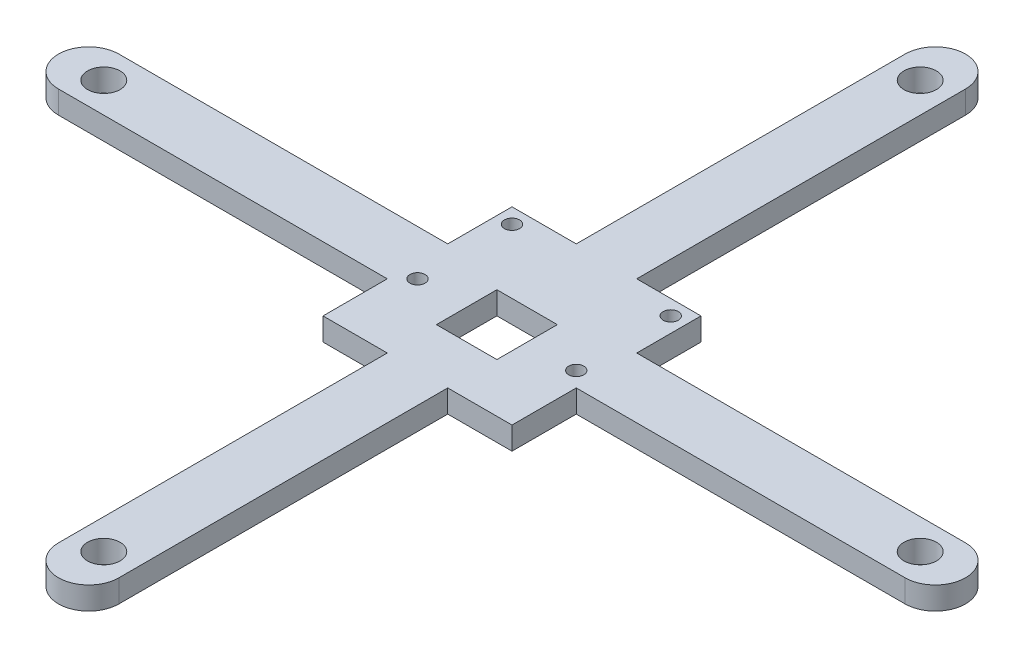
ISO-10303-21;
HEADER;
FILE_DESCRIPTION(('STEP AP214'),'2;1');
FILE_NAME('part.step','',(''),(''),'','','');
FILE_SCHEMA(('AUTOMOTIVE_DESIGN { 1 0 10303 214 1 1 1 1 }'));
ENDSEC;
DATA;
#1=APPLICATION_CONTEXT('core data for automotive mechanical design processes');
#2=APPLICATION_PROTOCOL_DEFINITION('international standard','automotive_design',2000,#1);
#3=PRODUCT_CONTEXT('',#1,'mechanical');
#4=PRODUCT('Part','Part','',(#3));
#5=PRODUCT_RELATED_PRODUCT_CATEGORY('part','',(#4));
#6=PRODUCT_DEFINITION_FORMATION('','',#4);
#7=PRODUCT_DEFINITION_CONTEXT('part definition',#1,'design');
#8=PRODUCT_DEFINITION('design','',#6,#7);
#9=PRODUCT_DEFINITION_SHAPE('','',#8);
#10=(LENGTH_UNIT() NAMED_UNIT(*) SI_UNIT(.MILLI.,.METRE.));
#11=(NAMED_UNIT(*) PLANE_ANGLE_UNIT() SI_UNIT($,.RADIAN.));
#12=(NAMED_UNIT(*) SI_UNIT($,.STERADIAN.) SOLID_ANGLE_UNIT());
#13=UNCERTAINTY_MEASURE_WITH_UNIT(LENGTH_MEASURE(1.E-05),#10,'distance_accuracy_value','');
#14=(GEOMETRIC_REPRESENTATION_CONTEXT(3) GLOBAL_UNCERTAINTY_ASSIGNED_CONTEXT((#13)) GLOBAL_UNIT_ASSIGNED_CONTEXT((#10,
#11,#12)) REPRESENTATION_CONTEXT('',''));
#15=CARTESIAN_POINT('',(0.,0.,0.));
#16=DIRECTION('',(0.,0.,1.));
#17=DIRECTION('',(1.,0.,0.));
#18=AXIS2_PLACEMENT_3D('',#15,#16,#17);
#19=CARTESIAN_POINT('',(55.9999998056097,3.,0.));
#20=DIRECTION('',(0.,1.,0.));
#21=DIRECTION('',(0.,0.,1.));
#22=AXIS2_PLACEMENT_3D('',#19,#20,#21);
#23=PLANE('',#22);
#24=CARTESIAN_POINT('',(54.,3.,0.));
#25=DIRECTION('',(0.,1.,0.));
#26=DIRECTION('',(0.,0.,1.));
#27=AXIS2_PLACEMENT_3D('',#24,#25,#26);
#28=CIRCLE('',#27,2.15);
#29=CARTESIAN_POINT('',(54.,3.,2.14999999999999));
#30=VERTEX_POINT('',#29);
#31=EDGE_CURVE('E959',#30,#30,#28,.T.);
#32=ORIENTED_EDGE('',*,*,#31,.F.);
#33=EDGE_LOOP('',(#32));
#34=FACE_BOUND('',#33,.T.);
#35=CARTESIAN_POINT('',(-54.,3.,0.));
#36=DIRECTION('',(0.,1.,0.));
#37=DIRECTION('',(0.,0.,1.));
#38=AXIS2_PLACEMENT_3D('',#35,#36,#37);
#39=CIRCLE('',#38,2.15);
#40=CARTESIAN_POINT('',(-54.,3.,2.15));
#41=VERTEX_POINT('',#40);
#42=EDGE_CURVE('E240',#41,#41,#39,.T.);
#43=ORIENTED_EDGE('',*,*,#42,.F.);
#44=EDGE_LOOP('',(#43));
#45=FACE_BOUND('',#44,.T.);
#46=CARTESIAN_POINT('',(-10.5,3.,2.));
#47=DIRECTION('',(0.,1.,0.));
#48=DIRECTION('',(0.,0.,1.));
#49=AXIS2_PLACEMENT_3D('',#46,#47,#48);
#50=CIRCLE('',#49,1.);
#51=CARTESIAN_POINT('',(-10.5,3.,3.));
#52=VERTEX_POINT('',#51);
#53=EDGE_CURVE('E264',#52,#52,#50,.T.);
#54=ORIENTED_EDGE('',*,*,#53,.F.);
#55=EDGE_LOOP('',(#54));
#56=FACE_BOUND('',#55,.T.);
#57=CARTESIAN_POINT('',(-10.5,3.,-10.5));
#58=DIRECTION('',(0.,1.,0.));
#59=DIRECTION('',(0.,0.,1.));
#60=AXIS2_PLACEMENT_3D('',#57,#58,#59);
#61=CIRCLE('',#60,1.);
#62=CARTESIAN_POINT('',(-10.5,3.,-9.5));
#63=VERTEX_POINT('',#62);
#64=EDGE_CURVE('E280',#63,#63,#61,.T.);
#65=ORIENTED_EDGE('',*,*,#64,.F.);
#66=EDGE_LOOP('',(#65));
#67=FACE_BOUND('',#66,.T.);
#68=CARTESIAN_POINT('',(55.9999998056097,3.,0.));
#69=DIRECTION('',(0.,1.,0.));
#70=DIRECTION('',(0.,0.,1.));
#71=AXIS2_PLACEMENT_3D('',#68,#69,#70);
#72=CIRCLE('',#71,4.00000019439034);
#73=CARTESIAN_POINT('',(55.99875276,3.,4.));
#74=VERTEX_POINT('',#73);
#75=CARTESIAN_POINT('',(55.99875276,3.,-4.00000000000001));
#76=VERTEX_POINT('',#75);
#77=EDGE_CURVE('E288',#74,#76,#72,.T.);
#78=ORIENTED_EDGE('',*,*,#77,.T.);
#79=DIRECTION('',(-1.,0.,0.));
#80=VECTOR('',#79,1.);
#81=CARTESIAN_POINT('',(12.5,3.,-4.00000000000001));
#82=LINE('',#81,#80);
#83=CARTESIAN_POINT('',(12.5,3.,-4.00000000000001));
#84=VERTEX_POINT('',#83);
#85=EDGE_CURVE('E292',#76,#84,#82,.T.);
#86=ORIENTED_EDGE('',*,*,#85,.T.);
#87=DIRECTION('',(0.,0.,-1.));
#88=VECTOR('',#87,1.);
#89=CARTESIAN_POINT('',(12.5,3.,-4.00000000000001));
#90=LINE('',#89,#88);
#91=CARTESIAN_POINT('',(12.5,3.,-12.5));
#92=VERTEX_POINT('',#91);
#93=EDGE_CURVE('E296',#84,#92,#90,.T.);
#94=ORIENTED_EDGE('',*,*,#93,.T.);
#95=DIRECTION('',(-1.,0.,0.));
#96=VECTOR('',#95,1.);
#97=CARTESIAN_POINT('',(4.00000000000001,3.,-12.5));
#98=LINE('',#97,#96);
#99=CARTESIAN_POINT('',(4.00000000000001,3.,-12.5));
#100=VERTEX_POINT('',#99);
#101=EDGE_CURVE('E299',#92,#100,#98,.T.);
#102=ORIENTED_EDGE('',*,*,#101,.T.);
#103=DIRECTION('',(0.,0.,-1.));
#104=VECTOR('',#103,1.);
#105=CARTESIAN_POINT('',(4.00000000000001,3.,-55.99875276));
#106=LINE('',#105,#104);
#107=CARTESIAN_POINT('',(4.,3.,-55.99875276));
#108=VERTEX_POINT('',#107);
#109=EDGE_CURVE('E302',#100,#108,#106,.T.);
#110=ORIENTED_EDGE('',*,*,#109,.T.);
#111=CARTESIAN_POINT('',(0.,3.,-55.9999998056097));
#112=DIRECTION('',(0.,1.,0.));
#113=DIRECTION('',(0.,0.,1.));
#114=AXIS2_PLACEMENT_3D('',#111,#112,#113);
#115=CIRCLE('',#114,4.00000019439034);
#116=CARTESIAN_POINT('',(-4.,3.,-55.99875276));
#117=VERTEX_POINT('',#116);
#118=EDGE_CURVE('E305',#108,#117,#115,.T.);
#119=ORIENTED_EDGE('',*,*,#118,.T.);
#120=DIRECTION('',(0.,0.,1.));
#121=VECTOR('',#120,1.);
#122=CARTESIAN_POINT('',(-4.,3.,-12.5));
#123=LINE('',#122,#121);
#124=CARTESIAN_POINT('',(-4.,3.,-12.5));
#125=VERTEX_POINT('',#124);
#126=EDGE_CURVE('E308',#117,#125,#123,.T.);
#127=ORIENTED_EDGE('',*,*,#126,.T.);
#128=DIRECTION('',(-1.,0.,0.));
#129=VECTOR('',#128,1.);
#130=CARTESIAN_POINT('',(-12.5,3.,-12.5));
#131=LINE('',#130,#129);
#132=CARTESIAN_POINT('',(-12.5,3.,-12.5));
#133=VERTEX_POINT('',#132);
#134=EDGE_CURVE('E311',#125,#133,#131,.T.);
#135=ORIENTED_EDGE('',*,*,#134,.T.);
#136=DIRECTION('',(0.,0.,1.));
#137=VECTOR('',#136,1.);
#138=CARTESIAN_POINT('',(-12.5,3.,-4.00000000000001));
#139=LINE('',#138,#137);
#140=CARTESIAN_POINT('',(-12.5,3.,-4.00000000000001));
#141=VERTEX_POINT('',#140);
#142=EDGE_CURVE('E314',#133,#141,#139,.T.);
#143=ORIENTED_EDGE('',*,*,#142,.T.);
#144=DIRECTION('',(-1.,0.,0.));
#145=VECTOR('',#144,1.);
#146=CARTESIAN_POINT('',(-55.99875276,3.,-4.00000000000001));
#147=LINE('',#146,#145);
#148=CARTESIAN_POINT('',(-55.99875276,3.,-4.));
#149=VERTEX_POINT('',#148);
#150=EDGE_CURVE('E317',#141,#149,#147,.T.);
#151=ORIENTED_EDGE('',*,*,#150,.T.);
#152=CARTESIAN_POINT('',(-56.0000001943903,3.,0.));
#153=DIRECTION('',(0.,1.,0.));
#154=DIRECTION('',(0.,0.,1.));
#155=AXIS2_PLACEMENT_3D('',#152,#153,#154);
#156=CIRCLE('',#155,4.00000019451157);
#157=CARTESIAN_POINT('',(-55.99875276,3.,4.));
#158=VERTEX_POINT('',#157);
#159=EDGE_CURVE('E320',#149,#158,#156,.T.);
#160=ORIENTED_EDGE('',*,*,#159,.T.);
#161=DIRECTION('',(1.,0.,0.));
#162=VECTOR('',#161,1.);
#163=CARTESIAN_POINT('',(-55.99875276,3.,4.));
#164=LINE('',#163,#162);
#165=CARTESIAN_POINT('',(-12.5,3.,4.00000000000001));
#166=VERTEX_POINT('',#165);
#167=EDGE_CURVE('E323',#158,#166,#164,.T.);
#168=ORIENTED_EDGE('',*,*,#167,.T.);
#169=DIRECTION('',(0.,0.,1.));
#170=VECTOR('',#169,1.);
#171=CARTESIAN_POINT('',(-12.5,3.,12.5));
#172=LINE('',#171,#170);
#173=CARTESIAN_POINT('',(-12.5,3.,12.5));
#174=VERTEX_POINT('',#173);
#175=EDGE_CURVE('E326',#166,#174,#172,.T.);
#176=ORIENTED_EDGE('',*,*,#175,.T.);
#177=DIRECTION('',(1.,0.,0.));
#178=VECTOR('',#177,1.);
#179=CARTESIAN_POINT('',(-12.5,3.,12.5));
#180=LINE('',#179,#178);
#181=CARTESIAN_POINT('',(-4.,3.,12.5));
#182=VERTEX_POINT('',#181);
#183=EDGE_CURVE('E329',#174,#182,#180,.T.);
#184=ORIENTED_EDGE('',*,*,#183,.T.);
#185=DIRECTION('',(0.,0.,1.));
#186=VECTOR('',#185,1.);
#187=CARTESIAN_POINT('',(-4.,3.,55.99875276));
#188=LINE('',#187,#186);
#189=CARTESIAN_POINT('',(-3.99999999999999,3.,55.99875276));
#190=VERTEX_POINT('',#189);
#191=EDGE_CURVE('E332',#182,#190,#188,.T.);
#192=ORIENTED_EDGE('',*,*,#191,.T.);
#193=CARTESIAN_POINT('',(0.,3.,55.99875276));
#194=DIRECTION('',(0.,1.,0.));
#195=DIRECTION('',(0.,0.,1.));
#196=AXIS2_PLACEMENT_3D('',#193,#194,#195);
#197=CIRCLE('',#196,4.);
#198=CARTESIAN_POINT('',(4.00000000000001,3.,55.99875276));
#199=VERTEX_POINT('',#198);
#200=EDGE_CURVE('E335',#190,#199,#197,.T.);
#201=ORIENTED_EDGE('',*,*,#200,.T.);
#202=DIRECTION('',(0.,0.,-1.));
#203=VECTOR('',#202,1.);
#204=CARTESIAN_POINT('',(4.00000000000001,3.,12.5));
#205=LINE('',#204,#203);
#206=CARTESIAN_POINT('',(4.00000000000001,3.,12.5));
#207=VERTEX_POINT('',#206);
#208=EDGE_CURVE('E338',#199,#207,#205,.T.);
#209=ORIENTED_EDGE('',*,*,#208,.T.);
#210=DIRECTION('',(1.,0.,0.));
#211=VECTOR('',#210,1.);
#212=CARTESIAN_POINT('',(4.00000000000001,3.,12.5));
#213=LINE('',#212,#211);
#214=CARTESIAN_POINT('',(12.5,3.,12.5));
#215=VERTEX_POINT('',#214);
#216=EDGE_CURVE('E341',#207,#215,#213,.T.);
#217=ORIENTED_EDGE('',*,*,#216,.T.);
#218=DIRECTION('',(0.,0.,-1.));
#219=VECTOR('',#218,1.);
#220=CARTESIAN_POINT('',(12.5,3.,12.5));
#221=LINE('',#220,#219);
#222=CARTESIAN_POINT('',(12.5,3.,4.00000000000001));
#223=VERTEX_POINT('',#222);
#224=EDGE_CURVE('E344',#215,#223,#221,.T.);
#225=ORIENTED_EDGE('',*,*,#224,.T.);
#226=DIRECTION('',(1.,0.,0.));
#227=VECTOR('',#226,1.);
#228=CARTESIAN_POINT('',(12.5,3.,4.00000000000001));
#229=LINE('',#228,#227);
#230=EDGE_CURVE('E347',#223,#74,#229,.T.);
#231=ORIENTED_EDGE('',*,*,#230,.T.);
#232=EDGE_LOOP('',(#78,#86,#94,#102,#110,#119,#127,#135,#143,#151,#160,#168,#176,#184,#192,#201,
#209,#217,#225,#231));
#233=FACE_BOUND('',#232,.T.);
#234=CARTESIAN_POINT('',(10.5,3.,-10.5));
#235=DIRECTION('',(0.,1.,0.));
#236=DIRECTION('',(0.,0.,1.));
#237=AXIS2_PLACEMENT_3D('',#234,#235,#236);
#238=CIRCLE('',#237,1.);
#239=CARTESIAN_POINT('',(10.5,3.,-9.5));
#240=VERTEX_POINT('',#239);
#241=EDGE_CURVE('E272',#240,#240,#238,.T.);
#242=ORIENTED_EDGE('',*,*,#241,.F.);
#243=EDGE_LOOP('',(#242));
#244=FACE_BOUND('',#243,.T.);
#245=CARTESIAN_POINT('',(10.5,3.,2.));
#246=DIRECTION('',(0.,1.,0.));
#247=DIRECTION('',(0.,0.,1.));
#248=AXIS2_PLACEMENT_3D('',#245,#246,#247);
#249=CIRCLE('',#248,1.);
#250=CARTESIAN_POINT('',(10.5,3.,3.));
#251=VERTEX_POINT('',#250);
#252=EDGE_CURVE('E256',#251,#251,#249,.T.);
#253=ORIENTED_EDGE('',*,*,#252,.F.);
#254=EDGE_LOOP('',(#253));
#255=FACE_BOUND('',#254,.T.);
#256=DIRECTION('',(-1.,0.,0.));
#257=VECTOR('',#256,1.);
#258=CARTESIAN_POINT('',(-3.99999999999999,3.,-2.));
#259=LINE('',#258,#257);
#260=CARTESIAN_POINT('',(4.00000000000001,3.,-2.));
#261=VERTEX_POINT('',#260);
#262=CARTESIAN_POINT('',(-3.99999999999999,3.,-2.));
#263=VERTEX_POINT('',#262);
#264=EDGE_CURVE('E214',#261,#263,#259,.T.);
#265=ORIENTED_EDGE('',*,*,#264,.F.);
#266=DIRECTION('',(0.,0.,-1.));
#267=VECTOR('',#266,1.);
#268=CARTESIAN_POINT('',(4.,3.,6.));
#269=LINE('',#268,#267);
#270=CARTESIAN_POINT('',(4.,3.,6.));
#271=VERTEX_POINT('',#270);
#272=EDGE_CURVE('E205',#271,#261,#269,.T.);
#273=ORIENTED_EDGE('',*,*,#272,.F.);
#274=DIRECTION('',(1.,0.,0.));
#275=VECTOR('',#274,1.);
#276=CARTESIAN_POINT('',(-3.99999999999999,3.,6.));
#277=LINE('',#276,#275);
#278=CARTESIAN_POINT('',(-3.99999999999999,3.,6.));
#279=VERTEX_POINT('',#278);
#280=EDGE_CURVE('E232',#279,#271,#277,.T.);
#281=ORIENTED_EDGE('',*,*,#280,.F.);
#282=DIRECTION('',(0.,0.,1.));
#283=VECTOR('',#282,1.);
#284=CARTESIAN_POINT('',(-3.99999999999999,3.,6.));
#285=LINE('',#284,#283);
#286=EDGE_CURVE('E228',#263,#279,#285,.T.);
#287=ORIENTED_EDGE('',*,*,#286,.F.);
#288=EDGE_LOOP('',(#265,#273,#281,#287));
#289=FACE_BOUND('',#288,.T.);
#290=CARTESIAN_POINT('',(0.,3.,-54.));
#291=DIRECTION('',(0.,1.,0.));
#292=DIRECTION('',(0.,0.,1.));
#293=AXIS2_PLACEMENT_3D('',#290,#291,#292);
#294=CIRCLE('',#293,2.15);
#295=CARTESIAN_POINT('',(0.,3.,-51.85));
#296=VERTEX_POINT('',#295);
#297=EDGE_CURVE('E967',#296,#296,#294,.T.);
#298=ORIENTED_EDGE('',*,*,#297,.F.);
#299=EDGE_LOOP('',(#298));
#300=FACE_BOUND('',#299,.T.);
#301=CARTESIAN_POINT('',(0.,3.,54.));
#302=DIRECTION('',(0.,1.,0.));
#303=DIRECTION('',(0.,0.,1.));
#304=AXIS2_PLACEMENT_3D('',#301,#302,#303);
#305=CIRCLE('',#304,2.15);
#306=CARTESIAN_POINT('',(0.,3.,56.15));
#307=VERTEX_POINT('',#306);
#308=EDGE_CURVE('E948',#307,#307,#305,.T.);
#309=ORIENTED_EDGE('',*,*,#308,.F.);
#310=EDGE_LOOP('',(#309));
#311=FACE_BOUND('',#310,.T.);
#312=ADVANCED_FACE('F43',(#34,#45,#56,#67,#233,#244,#255,#289,#300,#311),#23,.T.);
#313=CARTESIAN_POINT('',(55.9999998056097,0.,0.));
#314=DIRECTION('',(0.,1.,0.));
#315=DIRECTION('',(0.,0.,1.));
#316=AXIS2_PLACEMENT_3D('',#313,#314,#315);
#317=PLANE('',#316);
#318=CARTESIAN_POINT('',(10.5,0.,2.));
#319=DIRECTION('',(0.,1.,0.));
#320=DIRECTION('',(0.,0.,1.));
#321=AXIS2_PLACEMENT_3D('',#318,#319,#320);
#322=CIRCLE('',#321,1.);
#323=CARTESIAN_POINT('',(10.5,0.,3.));
#324=VERTEX_POINT('',#323);
#325=EDGE_CURVE('E223',#324,#324,#322,.T.);
#326=ORIENTED_EDGE('',*,*,#325,.T.);
#327=EDGE_LOOP('',(#326));
#328=FACE_BOUND('',#327,.T.);
#329=CARTESIAN_POINT('',(-10.5,0.,2.));
#330=DIRECTION('',(0.,1.,0.));
#331=DIRECTION('',(0.,0.,1.));
#332=AXIS2_PLACEMENT_3D('',#329,#330,#331);
#333=CIRCLE('',#332,1.);
#334=CARTESIAN_POINT('',(-10.5,0.,3.));
#335=VERTEX_POINT('',#334);
#336=EDGE_CURVE('E260',#335,#335,#333,.T.);
#337=ORIENTED_EDGE('',*,*,#336,.T.);
#338=EDGE_LOOP('',(#337));
#339=FACE_BOUND('',#338,.T.);
#340=CARTESIAN_POINT('',(10.5,0.,-10.5));
#341=DIRECTION('',(0.,1.,0.));
#342=DIRECTION('',(0.,0.,1.));
#343=AXIS2_PLACEMENT_3D('',#340,#341,#342);
#344=CIRCLE('',#343,1.);
#345=CARTESIAN_POINT('',(10.5,0.,-9.5));
#346=VERTEX_POINT('',#345);
#347=EDGE_CURVE('E268',#346,#346,#344,.T.);
#348=ORIENTED_EDGE('',*,*,#347,.T.);
#349=EDGE_LOOP('',(#348));
#350=FACE_BOUND('',#349,.T.);
#351=CARTESIAN_POINT('',(-10.5,0.,-10.5));
#352=DIRECTION('',(0.,1.,0.));
#353=DIRECTION('',(0.,0.,1.));
#354=AXIS2_PLACEMENT_3D('',#351,#352,#353);
#355=CIRCLE('',#354,1.);
#356=CARTESIAN_POINT('',(-10.5,0.,-9.5));
#357=VERTEX_POINT('',#356);
#358=EDGE_CURVE('E276',#357,#357,#355,.T.);
#359=ORIENTED_EDGE('',*,*,#358,.T.);
#360=EDGE_LOOP('',(#359));
#361=FACE_BOUND('',#360,.T.);
#362=CARTESIAN_POINT('',(55.9999998056097,0.,0.));
#363=DIRECTION('',(0.,1.,0.));
#364=DIRECTION('',(0.,0.,1.));
#365=AXIS2_PLACEMENT_3D('',#362,#363,#364);
#366=CIRCLE('',#365,4.00000019439034);
#367=CARTESIAN_POINT('',(55.99875276,0.,4.));
#368=VERTEX_POINT('',#367);
#369=CARTESIAN_POINT('',(55.99875276,0.,-4.00000000000001));
#370=VERTEX_POINT('',#369);
#371=EDGE_CURVE('E284',#368,#370,#366,.T.);
#372=ORIENTED_EDGE('',*,*,#371,.F.);
#373=DIRECTION('',(1.,0.,0.));
#374=VECTOR('',#373,1.);
#375=CARTESIAN_POINT('',(12.5,0.,4.00000000000001));
#376=LINE('',#375,#374);
#377=CARTESIAN_POINT('',(12.5,0.,4.00000000000001));
#378=VERTEX_POINT('',#377);
#379=EDGE_CURVE('E293',#378,#368,#376,.T.);
#380=ORIENTED_EDGE('',*,*,#379,.F.);
#381=DIRECTION('',(0.,0.,-1.));
#382=VECTOR('',#381,1.);
#383=CARTESIAN_POINT('',(12.5,0.,12.5));
#384=LINE('',#383,#382);
#385=CARTESIAN_POINT('',(12.5,0.,12.5));
#386=VERTEX_POINT('',#385);
#387=EDGE_CURVE('E405',#386,#378,#384,.T.);
#388=ORIENTED_EDGE('',*,*,#387,.F.);
#389=DIRECTION('',(1.,0.,0.));
#390=VECTOR('',#389,1.);
#391=CARTESIAN_POINT('',(4.00000000000001,0.,12.5));
#392=LINE('',#391,#390);
#393=CARTESIAN_POINT('',(4.00000000000001,0.,12.5));
#394=VERTEX_POINT('',#393);
#395=EDGE_CURVE('E402',#394,#386,#392,.T.);
#396=ORIENTED_EDGE('',*,*,#395,.F.);
#397=DIRECTION('',(0.,0.,-1.));
#398=VECTOR('',#397,1.);
#399=CARTESIAN_POINT('',(4.00000000000001,0.,12.5));
#400=LINE('',#399,#398);
#401=CARTESIAN_POINT('',(4.00000000000001,0.,55.99875276));
#402=VERTEX_POINT('',#401);
#403=EDGE_CURVE('E399',#402,#394,#400,.T.);
#404=ORIENTED_EDGE('',*,*,#403,.F.);
#405=CARTESIAN_POINT('',(0.,0.,55.99875276));
#406=DIRECTION('',(0.,1.,0.));
#407=DIRECTION('',(0.,0.,1.));
#408=AXIS2_PLACEMENT_3D('',#405,#406,#407);
#409=CIRCLE('',#408,4.);
#410=CARTESIAN_POINT('',(-3.99999999999999,0.,55.99875276));
#411=VERTEX_POINT('',#410);
#412=EDGE_CURVE('E396',#411,#402,#409,.T.);
#413=ORIENTED_EDGE('',*,*,#412,.F.);
#414=DIRECTION('',(0.,0.,1.));
#415=VECTOR('',#414,1.);
#416=CARTESIAN_POINT('',(-4.,0.,55.99875276));
#417=LINE('',#416,#415);
#418=CARTESIAN_POINT('',(-4.,0.,12.5));
#419=VERTEX_POINT('',#418);
#420=EDGE_CURVE('E393',#419,#411,#417,.T.);
#421=ORIENTED_EDGE('',*,*,#420,.F.);
#422=DIRECTION('',(1.,0.,0.));
#423=VECTOR('',#422,1.);
#424=CARTESIAN_POINT('',(-12.5,0.,12.5));
#425=LINE('',#424,#423);
#426=CARTESIAN_POINT('',(-12.5,0.,12.5));
#427=VERTEX_POINT('',#426);
#428=EDGE_CURVE('E390',#427,#419,#425,.T.);
#429=ORIENTED_EDGE('',*,*,#428,.F.);
#430=DIRECTION('',(0.,0.,1.));
#431=VECTOR('',#430,1.);
#432=CARTESIAN_POINT('',(-12.5,0.,12.5));
#433=LINE('',#432,#431);
#434=CARTESIAN_POINT('',(-12.5,0.,4.00000000000001));
#435=VERTEX_POINT('',#434);
#436=EDGE_CURVE('E387',#435,#427,#433,.T.);
#437=ORIENTED_EDGE('',*,*,#436,.F.);
#438=DIRECTION('',(1.,0.,0.));
#439=VECTOR('',#438,1.);
#440=CARTESIAN_POINT('',(-55.99875276,0.,4.));
#441=LINE('',#440,#439);
#442=CARTESIAN_POINT('',(-55.99875276,0.,4.));
#443=VERTEX_POINT('',#442);
#444=EDGE_CURVE('E384',#443,#435,#441,.T.);
#445=ORIENTED_EDGE('',*,*,#444,.F.);
#446=CARTESIAN_POINT('',(-56.0000001943903,0.,0.));
#447=DIRECTION('',(0.,1.,0.));
#448=DIRECTION('',(0.,0.,1.));
#449=AXIS2_PLACEMENT_3D('',#446,#447,#448);
#450=CIRCLE('',#449,4.00000019451157);
#451=CARTESIAN_POINT('',(-55.99875276,0.,-4.));
#452=VERTEX_POINT('',#451);
#453=EDGE_CURVE('E381',#452,#443,#450,.T.);
#454=ORIENTED_EDGE('',*,*,#453,.F.);
#455=DIRECTION('',(-1.,0.,0.));
#456=VECTOR('',#455,1.);
#457=CARTESIAN_POINT('',(-55.99875276,0.,-4.00000000000001));
#458=LINE('',#457,#456);
#459=CARTESIAN_POINT('',(-12.5,0.,-4.00000000000001));
#460=VERTEX_POINT('',#459);
#461=EDGE_CURVE('E378',#460,#452,#458,.T.);
#462=ORIENTED_EDGE('',*,*,#461,.F.);
#463=DIRECTION('',(0.,0.,1.));
#464=VECTOR('',#463,1.);
#465=CARTESIAN_POINT('',(-12.5,0.,-4.00000000000001));
#466=LINE('',#465,#464);
#467=CARTESIAN_POINT('',(-12.5,0.,-12.5));
#468=VERTEX_POINT('',#467);
#469=EDGE_CURVE('E375',#468,#460,#466,.T.);
#470=ORIENTED_EDGE('',*,*,#469,.F.);
#471=DIRECTION('',(-1.,0.,0.));
#472=VECTOR('',#471,1.);
#473=CARTESIAN_POINT('',(-12.5,0.,-12.5));
#474=LINE('',#473,#472);
#475=CARTESIAN_POINT('',(-4.,0.,-12.5));
#476=VERTEX_POINT('',#475);
#477=EDGE_CURVE('E372',#476,#468,#474,.T.);
#478=ORIENTED_EDGE('',*,*,#477,.F.);
#479=DIRECTION('',(0.,0.,1.));
#480=VECTOR('',#479,1.);
#481=CARTESIAN_POINT('',(-4.,0.,-12.5));
#482=LINE('',#481,#480);
#483=CARTESIAN_POINT('',(-4.,0.,-55.99875276));
#484=VERTEX_POINT('',#483);
#485=EDGE_CURVE('E369',#484,#476,#482,.T.);
#486=ORIENTED_EDGE('',*,*,#485,.F.);
#487=CARTESIAN_POINT('',(0.,0.,-55.9999998056097));
#488=DIRECTION('',(0.,1.,0.));
#489=DIRECTION('',(0.,0.,1.));
#490=AXIS2_PLACEMENT_3D('',#487,#488,#489);
#491=CIRCLE('',#490,4.00000019439034);
#492=CARTESIAN_POINT('',(4.,0.,-55.99875276));
#493=VERTEX_POINT('',#492);
#494=EDGE_CURVE('E366',#493,#484,#491,.T.);
#495=ORIENTED_EDGE('',*,*,#494,.F.);
#496=DIRECTION('',(0.,0.,-1.));
#497=VECTOR('',#496,1.);
#498=CARTESIAN_POINT('',(4.00000000000001,0.,-55.99875276));
#499=LINE('',#498,#497);
#500=CARTESIAN_POINT('',(4.00000000000001,0.,-12.5));
#501=VERTEX_POINT('',#500);
#502=EDGE_CURVE('E363',#501,#493,#499,.T.);
#503=ORIENTED_EDGE('',*,*,#502,.F.);
#504=DIRECTION('',(-1.,0.,0.));
#505=VECTOR('',#504,1.);
#506=CARTESIAN_POINT('',(4.00000000000001,0.,-12.5));
#507=LINE('',#506,#505);
#508=CARTESIAN_POINT('',(12.5,0.,-12.5));
#509=VERTEX_POINT('',#508);
#510=EDGE_CURVE('E360',#509,#501,#507,.T.);
#511=ORIENTED_EDGE('',*,*,#510,.F.);
#512=DIRECTION('',(0.,0.,-1.));
#513=VECTOR('',#512,1.);
#514=CARTESIAN_POINT('',(12.5,0.,-4.00000000000001));
#515=LINE('',#514,#513);
#516=CARTESIAN_POINT('',(12.5,0.,-4.00000000000001));
#517=VERTEX_POINT('',#516);
#518=EDGE_CURVE('E357',#517,#509,#515,.T.);
#519=ORIENTED_EDGE('',*,*,#518,.F.);
#520=DIRECTION('',(-1.,0.,0.));
#521=VECTOR('',#520,1.);
#522=CARTESIAN_POINT('',(12.5,0.,-4.00000000000001));
#523=LINE('',#522,#521);
#524=EDGE_CURVE('E354',#370,#517,#523,.T.);
#525=ORIENTED_EDGE('',*,*,#524,.F.);
#526=EDGE_LOOP('',(#372,#380,#388,#396,#404,#413,#421,#429,#437,#445,#454,#462,#470,#478,#486,
#495,#503,#511,#519,#525));
#527=FACE_BOUND('',#526,.T.);
#528=DIRECTION('',(0.,0.,-1.));
#529=VECTOR('',#528,1.);
#530=CARTESIAN_POINT('',(4.,0.,6.));
#531=LINE('',#530,#529);
#532=CARTESIAN_POINT('',(4.,0.,6.));
#533=VERTEX_POINT('',#532);
#534=CARTESIAN_POINT('',(4.00000000000001,0.,-2.));
#535=VERTEX_POINT('',#534);
#536=EDGE_CURVE('E67',#533,#535,#531,.T.);
#537=ORIENTED_EDGE('',*,*,#536,.T.);
#538=DIRECTION('',(-1.,0.,0.));
#539=VECTOR('',#538,1.);
#540=CARTESIAN_POINT('',(-3.99999999999999,0.,-2.));
#541=LINE('',#540,#539);
#542=CARTESIAN_POINT('',(-3.99999999999999,0.,-2.));
#543=VERTEX_POINT('',#542);
#544=EDGE_CURVE('E221',#535,#543,#541,.T.);
#545=ORIENTED_EDGE('',*,*,#544,.T.);
#546=DIRECTION('',(0.,0.,1.));
#547=VECTOR('',#546,1.);
#548=CARTESIAN_POINT('',(-3.99999999999999,0.,6.));
#549=LINE('',#548,#547);
#550=CARTESIAN_POINT('',(-3.99999999999999,0.,6.));
#551=VERTEX_POINT('',#550);
#552=EDGE_CURVE('E243',#543,#551,#549,.T.);
#553=ORIENTED_EDGE('',*,*,#552,.T.);
#554=DIRECTION('',(1.,0.,0.));
#555=VECTOR('',#554,1.);
#556=CARTESIAN_POINT('',(-3.99999999999999,0.,6.));
#557=LINE('',#556,#555);
#558=EDGE_CURVE('E215',#551,#533,#557,.T.);
#559=ORIENTED_EDGE('',*,*,#558,.T.);
#560=EDGE_LOOP('',(#537,#545,#553,#559));
#561=FACE_BOUND('',#560,.T.);
#562=CARTESIAN_POINT('',(-54.,0.,0.));
#563=DIRECTION('',(0.,1.,0.));
#564=DIRECTION('',(0.,0.,1.));
#565=AXIS2_PLACEMENT_3D('',#562,#563,#564);
#566=CIRCLE('',#565,2.15);
#567=CARTESIAN_POINT('',(-54.,0.,2.15));
#568=VERTEX_POINT('',#567);
#569=EDGE_CURVE('E971',#568,#568,#566,.T.);
#570=ORIENTED_EDGE('',*,*,#569,.T.);
#571=EDGE_LOOP('',(#570));
#572=FACE_BOUND('',#571,.T.);
#573=CARTESIAN_POINT('',(0.,0.,-54.));
#574=DIRECTION('',(0.,1.,0.));
#575=DIRECTION('',(0.,0.,1.));
#576=AXIS2_PLACEMENT_3D('',#573,#574,#575);
#577=CIRCLE('',#576,2.15);
#578=CARTESIAN_POINT('',(0.,0.,-51.85));
#579=VERTEX_POINT('',#578);
#580=EDGE_CURVE('E963',#579,#579,#577,.T.);
#581=ORIENTED_EDGE('',*,*,#580,.T.);
#582=EDGE_LOOP('',(#581));
#583=FACE_BOUND('',#582,.T.);
#584=CARTESIAN_POINT('',(54.,0.,0.));
#585=DIRECTION('',(0.,1.,0.));
#586=DIRECTION('',(0.,0.,1.));
#587=AXIS2_PLACEMENT_3D('',#584,#585,#586);
#588=CIRCLE('',#587,2.15);
#589=CARTESIAN_POINT('',(54.,0.,2.14999999999999));
#590=VERTEX_POINT('',#589);
#591=EDGE_CURVE('E956',#590,#590,#588,.T.);
#592=ORIENTED_EDGE('',*,*,#591,.T.);
#593=EDGE_LOOP('',(#592));
#594=FACE_BOUND('',#593,.T.);
#595=CARTESIAN_POINT('',(0.,0.,54.));
#596=DIRECTION('',(0.,1.,0.));
#597=DIRECTION('',(0.,0.,1.));
#598=AXIS2_PLACEMENT_3D('',#595,#596,#597);
#599=CIRCLE('',#598,2.15);
#600=CARTESIAN_POINT('',(0.,0.,56.15));
#601=VERTEX_POINT('',#600);
#602=EDGE_CURVE('E951',#601,#601,#599,.T.);
#603=ORIENTED_EDGE('',*,*,#602,.T.);
#604=EDGE_LOOP('',(#603));
#605=FACE_BOUND('',#604,.T.);
#606=ADVANCED_FACE('F492',(#328,#339,#350,#361,#527,#561,#572,#583,#594,#605),#317,.F.);
#607=CARTESIAN_POINT('',(55.9999998056097,3.,0.));
#608=DIRECTION('',(0.,-1.,0.));
#609=DIRECTION('',(0.,0.,-1.));
#610=AXIS2_PLACEMENT_3D('',#607,#608,#609);
#611=CYLINDRICAL_SURFACE('',#610,4.00000019439034);
#612=ORIENTED_EDGE('',*,*,#371,.T.);
#613=DIRECTION('',(0.,-1.,0.));
#614=VECTOR('',#613,1.);
#615=CARTESIAN_POINT('',(55.99875276,3.,-4.00000000000001));
#616=LINE('',#615,#614);
#617=EDGE_CURVE('E11',#76,#370,#616,.T.);
#618=ORIENTED_EDGE('',*,*,#617,.F.);
#619=ORIENTED_EDGE('',*,*,#77,.F.);
#620=DIRECTION('',(0.,-1.,0.));
#621=VECTOR('',#620,1.);
#622=CARTESIAN_POINT('',(55.99875276,3.,4.));
#623=LINE('',#622,#621);
#624=EDGE_CURVE('E350',#74,#368,#623,.T.);
#625=ORIENTED_EDGE('',*,*,#624,.T.);
#626=EDGE_LOOP('',(#612,#618,#619,#625));
#627=FACE_BOUND('',#626,.T.);
#628=ADVANCED_FACE('F45',(#627),#611,.T.);
#629=CARTESIAN_POINT('',(12.5,3.,-4.00000000000001));
#630=DIRECTION('',(0.,0.,1.));
#631=DIRECTION('',(1.,0.,0.));
#632=AXIS2_PLACEMENT_3D('',#629,#630,#631);
#633=PLANE('',#632);
#634=ORIENTED_EDGE('',*,*,#524,.T.);
#635=DIRECTION('',(0.,-1.,0.));
#636=VECTOR('',#635,1.);
#637=CARTESIAN_POINT('',(12.5,3.,-4.00000000000001));
#638=LINE('',#637,#636);
#639=EDGE_CURVE('E52',#84,#517,#638,.T.);
#640=ORIENTED_EDGE('',*,*,#639,.F.);
#641=ORIENTED_EDGE('',*,*,#85,.F.);
#642=ORIENTED_EDGE('',*,*,#617,.T.);
#643=EDGE_LOOP('',(#634,#640,#641,#642));
#644=FACE_BOUND('',#643,.T.);
#645=ADVANCED_FACE('F510',(#644),#633,.F.);
#646=CARTESIAN_POINT('',(12.5,3.,-4.00000000000001));
#647=DIRECTION('',(-1.,0.,0.));
#648=DIRECTION('',(0.,0.,1.));
#649=AXIS2_PLACEMENT_3D('',#646,#647,#648);
#650=PLANE('',#649);
#651=ORIENTED_EDGE('',*,*,#518,.T.);
#652=DIRECTION('',(0.,-1.,0.));
#653=VECTOR('',#652,1.);
#654=CARTESIAN_POINT('',(12.5,3.,-12.5));
#655=LINE('',#654,#653);
#656=EDGE_CURVE('E477',#92,#509,#655,.T.);
#657=ORIENTED_EDGE('',*,*,#656,.F.);
#658=ORIENTED_EDGE('',*,*,#93,.F.);
#659=ORIENTED_EDGE('',*,*,#639,.T.);
#660=EDGE_LOOP('',(#651,#657,#658,#659));
#661=FACE_BOUND('',#660,.T.);
#662=ADVANCED_FACE('F486',(#661),#650,.F.);
#663=CARTESIAN_POINT('',(4.00000000000001,3.,-12.5));
#664=DIRECTION('',(0.,0.,1.));
#665=DIRECTION('',(1.,0.,0.));
#666=AXIS2_PLACEMENT_3D('',#663,#664,#665);
#667=PLANE('',#666);
#668=ORIENTED_EDGE('',*,*,#510,.T.);
#669=DIRECTION('',(0.,-1.,0.));
#670=VECTOR('',#669,1.);
#671=CARTESIAN_POINT('',(4.00000000000001,3.,-12.5));
#672=LINE('',#671,#670);
#673=EDGE_CURVE('E473',#100,#501,#672,.T.);
#674=ORIENTED_EDGE('',*,*,#673,.F.);
#675=ORIENTED_EDGE('',*,*,#101,.F.);
#676=ORIENTED_EDGE('',*,*,#656,.T.);
#677=EDGE_LOOP('',(#668,#674,#675,#676));
#678=FACE_BOUND('',#677,.T.);
#679=ADVANCED_FACE('F498',(#678),#667,.F.);
#680=CARTESIAN_POINT('',(4.00000000000001,3.,-55.99875276));
#681=DIRECTION('',(-1.,0.,0.));
#682=DIRECTION('',(0.,0.,1.));
#683=AXIS2_PLACEMENT_3D('',#680,#681,#682);
#684=PLANE('',#683);
#685=ORIENTED_EDGE('',*,*,#502,.T.);
#686=DIRECTION('',(0.,-1.,0.));
#687=VECTOR('',#686,1.);
#688=CARTESIAN_POINT('',(4.,3.,-55.99875276));
#689=LINE('',#688,#687);
#690=EDGE_CURVE('E469',#108,#493,#689,.T.);
#691=ORIENTED_EDGE('',*,*,#690,.F.);
#692=ORIENTED_EDGE('',*,*,#109,.F.);
#693=ORIENTED_EDGE('',*,*,#673,.T.);
#694=EDGE_LOOP('',(#685,#691,#692,#693));
#695=FACE_BOUND('',#694,.T.);
#696=ADVANCED_FACE('F502',(#695),#684,.F.);
#697=CARTESIAN_POINT('',(0.,3.,-55.9999998056097));
#698=DIRECTION('',(0.,-1.,0.));
#699=DIRECTION('',(0.,0.,-1.));
#700=AXIS2_PLACEMENT_3D('',#697,#698,#699);
#701=CYLINDRICAL_SURFACE('',#700,4.00000019439034);
#702=ORIENTED_EDGE('',*,*,#494,.T.);
#703=DIRECTION('',(0.,-1.,0.));
#704=VECTOR('',#703,1.);
#705=CARTESIAN_POINT('',(-4.,3.,-55.99875276));
#706=LINE('',#705,#704);
#707=EDGE_CURVE('E465',#117,#484,#706,.T.);
#708=ORIENTED_EDGE('',*,*,#707,.F.);
#709=ORIENTED_EDGE('',*,*,#118,.F.);
#710=ORIENTED_EDGE('',*,*,#690,.T.);
#711=EDGE_LOOP('',(#702,#708,#709,#710));
#712=FACE_BOUND('',#711,.T.);
#713=ADVANCED_FACE('F583',(#712),#701,.T.);
#714=CARTESIAN_POINT('',(-4.,3.,-12.5));
#715=DIRECTION('',(1.,0.,0.));
#716=DIRECTION('',(0.,0.,-1.));
#717=AXIS2_PLACEMENT_3D('',#714,#715,#716);
#718=PLANE('',#717);
#719=ORIENTED_EDGE('',*,*,#485,.T.);
#720=DIRECTION('',(0.,-1.,0.));
#721=VECTOR('',#720,1.);
#722=CARTESIAN_POINT('',(-4.,3.,-12.5));
#723=LINE('',#722,#721);
#724=EDGE_CURVE('E461',#125,#476,#723,.T.);
#725=ORIENTED_EDGE('',*,*,#724,.F.);
#726=ORIENTED_EDGE('',*,*,#126,.F.);
#727=ORIENTED_EDGE('',*,*,#707,.T.);
#728=EDGE_LOOP('',(#719,#725,#726,#727));
#729=FACE_BOUND('',#728,.T.);
#730=ADVANCED_FACE('F581',(#729),#718,.F.);
#731=CARTESIAN_POINT('',(-12.5,3.,-12.5));
#732=DIRECTION('',(0.,0.,1.));
#733=DIRECTION('',(1.,0.,0.));
#734=AXIS2_PLACEMENT_3D('',#731,#732,#733);
#735=PLANE('',#734);
#736=ORIENTED_EDGE('',*,*,#477,.T.);
#737=DIRECTION('',(0.,-1.,0.));
#738=VECTOR('',#737,1.);
#739=CARTESIAN_POINT('',(-12.5,3.,-12.5));
#740=LINE('',#739,#738);
#741=EDGE_CURVE('E457',#133,#468,#740,.T.);
#742=ORIENTED_EDGE('',*,*,#741,.F.);
#743=ORIENTED_EDGE('',*,*,#134,.F.);
#744=ORIENTED_EDGE('',*,*,#724,.T.);
#745=EDGE_LOOP('',(#736,#742,#743,#744));
#746=FACE_BOUND('',#745,.T.);
#747=ADVANCED_FACE('F576',(#746),#735,.F.);
#748=CARTESIAN_POINT('',(-12.5,3.,-4.00000000000001));
#749=DIRECTION('',(1.,0.,0.));
#750=DIRECTION('',(0.,0.,-1.));
#751=AXIS2_PLACEMENT_3D('',#748,#749,#750);
#752=PLANE('',#751);
#753=ORIENTED_EDGE('',*,*,#469,.T.);
#754=DIRECTION('',(0.,-1.,0.));
#755=VECTOR('',#754,1.);
#756=CARTESIAN_POINT('',(-12.5,3.,-4.00000000000001));
#757=LINE('',#756,#755);
#758=EDGE_CURVE('E453',#141,#460,#757,.T.);
#759=ORIENTED_EDGE('',*,*,#758,.F.);
#760=ORIENTED_EDGE('',*,*,#142,.F.);
#761=ORIENTED_EDGE('',*,*,#741,.T.);
#762=EDGE_LOOP('',(#753,#759,#760,#761));
#763=FACE_BOUND('',#762,.T.);
#764=ADVANCED_FACE('F571',(#763),#752,.F.);
#765=CARTESIAN_POINT('',(-55.99875276,3.,-4.00000000000001));
#766=DIRECTION('',(0.,0.,1.));
#767=DIRECTION('',(1.,0.,0.));
#768=AXIS2_PLACEMENT_3D('',#765,#766,#767);
#769=PLANE('',#768);
#770=ORIENTED_EDGE('',*,*,#461,.T.);
#771=DIRECTION('',(0.,-1.,0.));
#772=VECTOR('',#771,1.);
#773=CARTESIAN_POINT('',(-55.99875276,3.,-4.));
#774=LINE('',#773,#772);
#775=EDGE_CURVE('E449',#149,#452,#774,.T.);
#776=ORIENTED_EDGE('',*,*,#775,.F.);
#777=ORIENTED_EDGE('',*,*,#150,.F.);
#778=ORIENTED_EDGE('',*,*,#758,.T.);
#779=EDGE_LOOP('',(#770,#776,#777,#778));
#780=FACE_BOUND('',#779,.T.);
#781=ADVANCED_FACE('F567',(#780),#769,.F.);
#782=CARTESIAN_POINT('',(-56.0000001943903,3.,0.));
#783=DIRECTION('',(0.,-1.,0.));
#784=DIRECTION('',(0.,0.,-1.));
#785=AXIS2_PLACEMENT_3D('',#782,#783,#784);
#786=CYLINDRICAL_SURFACE('',#785,4.00000019451157);
#787=ORIENTED_EDGE('',*,*,#453,.T.);
#788=DIRECTION('',(0.,-1.,0.));
#789=VECTOR('',#788,1.);
#790=CARTESIAN_POINT('',(-55.99875276,3.,4.));
#791=LINE('',#790,#789);
#792=EDGE_CURVE('E445',#158,#443,#791,.T.);
#793=ORIENTED_EDGE('',*,*,#792,.F.);
#794=ORIENTED_EDGE('',*,*,#159,.F.);
#795=ORIENTED_EDGE('',*,*,#775,.T.);
#796=EDGE_LOOP('',(#787,#793,#794,#795));
#797=FACE_BOUND('',#796,.T.);
#798=ADVANCED_FACE('F562',(#797),#786,.T.);
#799=CARTESIAN_POINT('',(-55.99875276,3.,4.));
#800=DIRECTION('',(0.,0.,-1.));
#801=DIRECTION('',(-1.,0.,0.));
#802=AXIS2_PLACEMENT_3D('',#799,#800,#801);
#803=PLANE('',#802);
#804=ORIENTED_EDGE('',*,*,#444,.T.);
#805=DIRECTION('',(0.,-1.,0.));
#806=VECTOR('',#805,1.);
#807=CARTESIAN_POINT('',(-12.5,3.,4.00000000000001));
#808=LINE('',#807,#806);
#809=EDGE_CURVE('E441',#166,#435,#808,.T.);
#810=ORIENTED_EDGE('',*,*,#809,.F.);
#811=ORIENTED_EDGE('',*,*,#167,.F.);
#812=ORIENTED_EDGE('',*,*,#792,.T.);
#813=EDGE_LOOP('',(#804,#810,#811,#812));
#814=FACE_BOUND('',#813,.T.);
#815=ADVANCED_FACE('F556',(#814),#803,.F.);
#816=CARTESIAN_POINT('',(-12.5,3.,12.5));
#817=DIRECTION('',(1.,0.,0.));
#818=DIRECTION('',(0.,0.,-1.));
#819=AXIS2_PLACEMENT_3D('',#816,#817,#818);
#820=PLANE('',#819);
#821=ORIENTED_EDGE('',*,*,#436,.T.);
#822=DIRECTION('',(0.,-1.,0.));
#823=VECTOR('',#822,1.);
#824=CARTESIAN_POINT('',(-12.5,3.,12.5));
#825=LINE('',#824,#823);
#826=EDGE_CURVE('E437',#174,#427,#825,.T.);
#827=ORIENTED_EDGE('',*,*,#826,.F.);
#828=ORIENTED_EDGE('',*,*,#175,.F.);
#829=ORIENTED_EDGE('',*,*,#809,.T.);
#830=EDGE_LOOP('',(#821,#827,#828,#829));
#831=FACE_BOUND('',#830,.T.);
#832=ADVANCED_FACE('F552',(#831),#820,.F.);
#833=CARTESIAN_POINT('',(-12.5,3.,12.5));
#834=DIRECTION('',(0.,0.,-1.));
#835=DIRECTION('',(-1.,0.,0.));
#836=AXIS2_PLACEMENT_3D('',#833,#834,#835);
#837=PLANE('',#836);
#838=ORIENTED_EDGE('',*,*,#428,.T.);
#839=DIRECTION('',(0.,-1.,0.));
#840=VECTOR('',#839,1.);
#841=CARTESIAN_POINT('',(-4.,3.,12.5));
#842=LINE('',#841,#840);
#843=EDGE_CURVE('E433',#182,#419,#842,.T.);
#844=ORIENTED_EDGE('',*,*,#843,.F.);
#845=ORIENTED_EDGE('',*,*,#183,.F.);
#846=ORIENTED_EDGE('',*,*,#826,.T.);
#847=EDGE_LOOP('',(#838,#844,#845,#846));
#848=FACE_BOUND('',#847,.T.);
#849=ADVANCED_FACE('F547',(#848),#837,.F.);
#850=CARTESIAN_POINT('',(-4.,3.,55.99875276));
#851=DIRECTION('',(1.,0.,0.));
#852=DIRECTION('',(0.,0.,-1.));
#853=AXIS2_PLACEMENT_3D('',#850,#851,#852);
#854=PLANE('',#853);
#855=ORIENTED_EDGE('',*,*,#420,.T.);
#856=DIRECTION('',(0.,-1.,0.));
#857=VECTOR('',#856,1.);
#858=CARTESIAN_POINT('',(-3.99999999999999,3.,55.99875276));
#859=LINE('',#858,#857);
#860=EDGE_CURVE('E429',#190,#411,#859,.T.);
#861=ORIENTED_EDGE('',*,*,#860,.F.);
#862=ORIENTED_EDGE('',*,*,#191,.F.);
#863=ORIENTED_EDGE('',*,*,#843,.T.);
#864=EDGE_LOOP('',(#855,#861,#862,#863));
#865=FACE_BOUND('',#864,.T.);
#866=ADVANCED_FACE('F541',(#865),#854,.F.);
#867=CARTESIAN_POINT('',(0.,3.,55.99875276));
#868=DIRECTION('',(0.,-1.,0.));
#869=DIRECTION('',(0.,0.,-1.));
#870=AXIS2_PLACEMENT_3D('',#867,#868,#869);
#871=CYLINDRICAL_SURFACE('',#870,4.);
#872=ORIENTED_EDGE('',*,*,#412,.T.);
#873=DIRECTION('',(0.,-1.,0.));
#874=VECTOR('',#873,1.);
#875=CARTESIAN_POINT('',(4.00000000000001,3.,55.99875276));
#876=LINE('',#875,#874);
#877=EDGE_CURVE('E425',#199,#402,#876,.T.);
#878=ORIENTED_EDGE('',*,*,#877,.F.);
#879=ORIENTED_EDGE('',*,*,#200,.F.);
#880=ORIENTED_EDGE('',*,*,#860,.T.);
#881=EDGE_LOOP('',(#872,#878,#879,#880));
#882=FACE_BOUND('',#881,.T.);
#883=ADVANCED_FACE('F537',(#882),#871,.T.);
#884=CARTESIAN_POINT('',(4.00000000000001,3.,12.5));
#885=DIRECTION('',(-1.,0.,0.));
#886=DIRECTION('',(0.,0.,1.));
#887=AXIS2_PLACEMENT_3D('',#884,#885,#886);
#888=PLANE('',#887);
#889=ORIENTED_EDGE('',*,*,#403,.T.);
#890=DIRECTION('',(0.,-1.,0.));
#891=VECTOR('',#890,1.);
#892=CARTESIAN_POINT('',(4.00000000000001,3.,12.5));
#893=LINE('',#892,#891);
#894=EDGE_CURVE('E421',#207,#394,#893,.T.);
#895=ORIENTED_EDGE('',*,*,#894,.F.);
#896=ORIENTED_EDGE('',*,*,#208,.F.);
#897=ORIENTED_EDGE('',*,*,#877,.T.);
#898=EDGE_LOOP('',(#889,#895,#896,#897));
#899=FACE_BOUND('',#898,.T.);
#900=ADVANCED_FACE('F532',(#899),#888,.F.);
#901=CARTESIAN_POINT('',(4.00000000000001,3.,12.5));
#902=DIRECTION('',(0.,0.,-1.));
#903=DIRECTION('',(-1.,0.,0.));
#904=AXIS2_PLACEMENT_3D('',#901,#902,#903);
#905=PLANE('',#904);
#906=ORIENTED_EDGE('',*,*,#395,.T.);
#907=DIRECTION('',(0.,-1.,0.));
#908=VECTOR('',#907,1.);
#909=CARTESIAN_POINT('',(12.5,3.,12.5));
#910=LINE('',#909,#908);
#911=EDGE_CURVE('E417',#215,#386,#910,.T.);
#912=ORIENTED_EDGE('',*,*,#911,.F.);
#913=ORIENTED_EDGE('',*,*,#216,.F.);
#914=ORIENTED_EDGE('',*,*,#894,.T.);
#915=EDGE_LOOP('',(#906,#912,#913,#914));
#916=FACE_BOUND('',#915,.T.);
#917=ADVANCED_FACE('F526',(#916),#905,.F.);
#918=CARTESIAN_POINT('',(12.5,3.,12.5));
#919=DIRECTION('',(-1.,0.,0.));
#920=DIRECTION('',(0.,0.,1.));
#921=AXIS2_PLACEMENT_3D('',#918,#919,#920);
#922=PLANE('',#921);
#923=ORIENTED_EDGE('',*,*,#387,.T.);
#924=DIRECTION('',(0.,-1.,0.));
#925=VECTOR('',#924,1.);
#926=CARTESIAN_POINT('',(12.5,3.,4.00000000000001));
#927=LINE('',#926,#925);
#928=EDGE_CURVE('E413',#223,#378,#927,.T.);
#929=ORIENTED_EDGE('',*,*,#928,.F.);
#930=ORIENTED_EDGE('',*,*,#224,.F.);
#931=ORIENTED_EDGE('',*,*,#911,.T.);
#932=EDGE_LOOP('',(#923,#929,#930,#931));
#933=FACE_BOUND('',#932,.T.);
#934=ADVANCED_FACE('F522',(#933),#922,.F.);
#935=CARTESIAN_POINT('',(12.5,3.,4.00000000000001));
#936=DIRECTION('',(0.,0.,-1.));
#937=DIRECTION('',(-1.,0.,0.));
#938=AXIS2_PLACEMENT_3D('',#935,#936,#937);
#939=PLANE('',#938);
#940=ORIENTED_EDGE('',*,*,#379,.T.);
#941=ORIENTED_EDGE('',*,*,#624,.F.);
#942=ORIENTED_EDGE('',*,*,#230,.F.);
#943=ORIENTED_EDGE('',*,*,#928,.T.);
#944=EDGE_LOOP('',(#940,#941,#942,#943));
#945=FACE_BOUND('',#944,.T.);
#946=ADVANCED_FACE('F517',(#945),#939,.F.);
#947=CARTESIAN_POINT('',(-10.5,3.,-10.5));
#948=DIRECTION('',(0.,-1.,0.));
#949=DIRECTION('',(0.,0.,-1.));
#950=AXIS2_PLACEMENT_3D('',#947,#948,#949);
#951=CYLINDRICAL_SURFACE('',#950,1.);
#952=ORIENTED_EDGE('',*,*,#64,.T.);
#953=EDGE_LOOP('',(#952));
#954=FACE_BOUND('',#953,.T.);
#955=ORIENTED_EDGE('',*,*,#358,.F.);
#956=EDGE_LOOP('',(#955));
#957=FACE_BOUND('',#956,.T.);
#958=ADVANCED_FACE('F603',(#954,#957),#951,.F.);
#959=CARTESIAN_POINT('',(10.5,3.,-10.5));
#960=DIRECTION('',(0.,-1.,0.));
#961=DIRECTION('',(0.,0.,-1.));
#962=AXIS2_PLACEMENT_3D('',#959,#960,#961);
#963=CYLINDRICAL_SURFACE('',#962,1.);
#964=ORIENTED_EDGE('',*,*,#241,.T.);
#965=EDGE_LOOP('',(#964));
#966=FACE_BOUND('',#965,.T.);
#967=ORIENTED_EDGE('',*,*,#347,.F.);
#968=EDGE_LOOP('',(#967));
#969=FACE_BOUND('',#968,.T.);
#970=ADVANCED_FACE('F689',(#966,#969),#963,.F.);
#971=CARTESIAN_POINT('',(-10.5,3.,2.));
#972=DIRECTION('',(0.,-1.,0.));
#973=DIRECTION('',(0.,0.,-1.));
#974=AXIS2_PLACEMENT_3D('',#971,#972,#973);
#975=CYLINDRICAL_SURFACE('',#974,1.);
#976=ORIENTED_EDGE('',*,*,#53,.T.);
#977=EDGE_LOOP('',(#976));
#978=FACE_BOUND('',#977,.T.);
#979=ORIENTED_EDGE('',*,*,#336,.F.);
#980=EDGE_LOOP('',(#979));
#981=FACE_BOUND('',#980,.T.);
#982=ADVANCED_FACE('F696',(#978,#981),#975,.F.);
#983=CARTESIAN_POINT('',(10.5,3.,2.));
#984=DIRECTION('',(0.,-1.,0.));
#985=DIRECTION('',(0.,0.,-1.));
#986=AXIS2_PLACEMENT_3D('',#983,#984,#985);
#987=CYLINDRICAL_SURFACE('',#986,1.);
#988=ORIENTED_EDGE('',*,*,#252,.T.);
#989=EDGE_LOOP('',(#988));
#990=FACE_BOUND('',#989,.T.);
#991=ORIENTED_EDGE('',*,*,#325,.F.);
#992=EDGE_LOOP('',(#991));
#993=FACE_BOUND('',#992,.T.);
#994=ADVANCED_FACE('F703',(#990,#993),#987,.F.);
#995=CARTESIAN_POINT('',(4.,3.,6.));
#996=DIRECTION('',(-1.,0.,0.));
#997=DIRECTION('',(0.,0.,1.));
#998=AXIS2_PLACEMENT_3D('',#995,#996,#997);
#999=PLANE('',#998);
#1000=ORIENTED_EDGE('',*,*,#536,.F.);
#1001=DIRECTION('',(0.,-1.,0.));
#1002=VECTOR('',#1001,1.);
#1003=CARTESIAN_POINT('',(4.,3.,6.));
#1004=LINE('',#1003,#1002);
#1005=EDGE_CURVE('E209',#271,#533,#1004,.T.);
#1006=ORIENTED_EDGE('',*,*,#1005,.F.);
#1007=ORIENTED_EDGE('',*,*,#272,.T.);
#1008=DIRECTION('',(0.,-1.,0.));
#1009=VECTOR('',#1008,1.);
#1010=CARTESIAN_POINT('',(4.00000000000001,3.,-2.));
#1011=LINE('',#1010,#1009);
#1012=EDGE_CURVE('E208',#261,#535,#1011,.T.);
#1013=ORIENTED_EDGE('',*,*,#1012,.T.);
#1014=EDGE_LOOP('',(#1000,#1006,#1007,#1013));
#1015=FACE_BOUND('',#1014,.T.);
#1016=ADVANCED_FACE('F207',(#1015),#999,.T.);
#1017=CARTESIAN_POINT('',(-3.99999999999999,3.,-2.));
#1018=DIRECTION('',(0.,0.,1.));
#1019=DIRECTION('',(1.,0.,0.));
#1020=AXIS2_PLACEMENT_3D('',#1017,#1018,#1019);
#1021=PLANE('',#1020);
#1022=ORIENTED_EDGE('',*,*,#544,.F.);
#1023=ORIENTED_EDGE('',*,*,#1012,.F.);
#1024=ORIENTED_EDGE('',*,*,#264,.T.);
#1025=DIRECTION('',(0.,-1.,0.));
#1026=VECTOR('',#1025,1.);
#1027=CARTESIAN_POINT('',(-3.99999999999999,3.,-2.));
#1028=LINE('',#1027,#1026);
#1029=EDGE_CURVE('E224',#263,#543,#1028,.T.);
#1030=ORIENTED_EDGE('',*,*,#1029,.T.);
#1031=EDGE_LOOP('',(#1022,#1023,#1024,#1030));
#1032=FACE_BOUND('',#1031,.T.);
#1033=ADVANCED_FACE('F218',(#1032),#1021,.T.);
#1034=CARTESIAN_POINT('',(-3.99999999999999,3.,6.));
#1035=DIRECTION('',(1.,0.,0.));
#1036=DIRECTION('',(0.,0.,-1.));
#1037=AXIS2_PLACEMENT_3D('',#1034,#1035,#1036);
#1038=PLANE('',#1037);
#1039=ORIENTED_EDGE('',*,*,#552,.F.);
#1040=ORIENTED_EDGE('',*,*,#1029,.F.);
#1041=ORIENTED_EDGE('',*,*,#286,.T.);
#1042=DIRECTION('',(0.,-1.,0.));
#1043=VECTOR('',#1042,1.);
#1044=CARTESIAN_POINT('',(-3.99999999999999,3.,6.));
#1045=LINE('',#1044,#1043);
#1046=EDGE_CURVE('E59',#279,#551,#1045,.T.);
#1047=ORIENTED_EDGE('',*,*,#1046,.T.);
#1048=EDGE_LOOP('',(#1039,#1040,#1041,#1047));
#1049=FACE_BOUND('',#1048,.T.);
#1050=ADVANCED_FACE('F724',(#1049),#1038,.T.);
#1051=CARTESIAN_POINT('',(-3.99999999999999,3.,6.));
#1052=DIRECTION('',(0.,0.,-1.));
#1053=DIRECTION('',(-1.,0.,0.));
#1054=AXIS2_PLACEMENT_3D('',#1051,#1052,#1053);
#1055=PLANE('',#1054);
#1056=ORIENTED_EDGE('',*,*,#558,.F.);
#1057=ORIENTED_EDGE('',*,*,#1046,.F.);
#1058=ORIENTED_EDGE('',*,*,#280,.T.);
#1059=ORIENTED_EDGE('',*,*,#1005,.T.);
#1060=EDGE_LOOP('',(#1056,#1057,#1058,#1059));
#1061=FACE_BOUND('',#1060,.T.);
#1062=ADVANCED_FACE('F731',(#1061),#1055,.T.);
#1063=CARTESIAN_POINT('',(-54.,3.,0.));
#1064=DIRECTION('',(0.,-1.,0.));
#1065=DIRECTION('',(0.,0.,-1.));
#1066=AXIS2_PLACEMENT_3D('',#1063,#1064,#1065);
#1067=CYLINDRICAL_SURFACE('',#1066,2.15);
#1068=ORIENTED_EDGE('',*,*,#42,.T.);
#1069=EDGE_LOOP('',(#1068));
#1070=FACE_BOUND('',#1069,.T.);
#1071=ORIENTED_EDGE('',*,*,#569,.F.);
#1072=EDGE_LOOP('',(#1071));
#1073=FACE_BOUND('',#1072,.T.);
#1074=ADVANCED_FACE('F739',(#1070,#1073),#1067,.F.);
#1075=CARTESIAN_POINT('',(0.,3.,-54.));
#1076=DIRECTION('',(0.,-1.,0.));
#1077=DIRECTION('',(0.,0.,-1.));
#1078=AXIS2_PLACEMENT_3D('',#1075,#1076,#1077);
#1079=CYLINDRICAL_SURFACE('',#1078,2.15);
#1080=ORIENTED_EDGE('',*,*,#297,.T.);
#1081=EDGE_LOOP('',(#1080));
#1082=FACE_BOUND('',#1081,.T.);
#1083=ORIENTED_EDGE('',*,*,#580,.F.);
#1084=EDGE_LOOP('',(#1083));
#1085=FACE_BOUND('',#1084,.T.);
#1086=ADVANCED_FACE('F746',(#1082,#1085),#1079,.F.);
#1087=CARTESIAN_POINT('',(54.,3.,0.));
#1088=DIRECTION('',(0.,-1.,0.));
#1089=DIRECTION('',(0.,0.,-1.));
#1090=AXIS2_PLACEMENT_3D('',#1087,#1088,#1089);
#1091=CYLINDRICAL_SURFACE('',#1090,2.15);
#1092=ORIENTED_EDGE('',*,*,#31,.T.);
#1093=EDGE_LOOP('',(#1092));
#1094=FACE_BOUND('',#1093,.T.);
#1095=ORIENTED_EDGE('',*,*,#591,.F.);
#1096=EDGE_LOOP('',(#1095));
#1097=FACE_BOUND('',#1096,.T.);
#1098=ADVANCED_FACE('F754',(#1094,#1097),#1091,.F.);
#1099=CARTESIAN_POINT('',(0.,3.,54.));
#1100=DIRECTION('',(0.,-1.,0.));
#1101=DIRECTION('',(0.,0.,-1.));
#1102=AXIS2_PLACEMENT_3D('',#1099,#1100,#1101);
#1103=CYLINDRICAL_SURFACE('',#1102,2.15);
#1104=ORIENTED_EDGE('',*,*,#308,.T.);
#1105=EDGE_LOOP('',(#1104));
#1106=FACE_BOUND('',#1105,.T.);
#1107=ORIENTED_EDGE('',*,*,#602,.F.);
#1108=EDGE_LOOP('',(#1107));
#1109=FACE_BOUND('',#1108,.T.);
#1110=ADVANCED_FACE('F762',(#1106,#1109),#1103,.F.);
#1111=CLOSED_SHELL('',(#312,#606,#628,#645,#662,#679,#696,#713,#730,#747,#764,#781,#798,#815,
#832,#849,#866,#883,#900,#917,#934,#946,#958,#970,#982,#994,#1016,#1033,#1050,#1062,#1074,#1086,
#1098,#1110));
#1112=MANIFOLD_SOLID_BREP('B2',#1111);
#1113=ADVANCED_BREP_SHAPE_REPRESENTATION('',(#18,#1112),#14);
#1114=SHAPE_DEFINITION_REPRESENTATION(#9,#1113);
ENDSEC;
END-ISO-10303-21;
